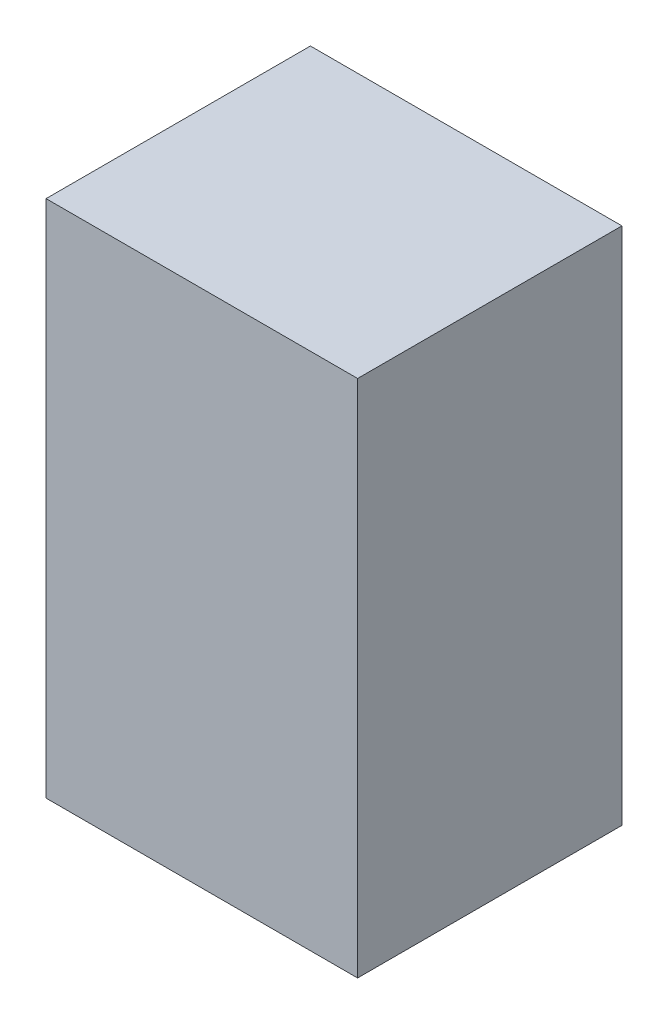
ISO-10303-21;
HEADER;
FILE_DESCRIPTION(('STEP AP214'),'2;1');
FILE_NAME('part.step','',(''),(''),'','','');
FILE_SCHEMA(('AUTOMOTIVE_DESIGN { 1 0 10303 214 1 1 1 1 }'));
ENDSEC;
DATA;
#1=APPLICATION_CONTEXT('core data for automotive mechanical design processes');
#2=APPLICATION_PROTOCOL_DEFINITION('international standard','automotive_design',2000,#1);
#3=PRODUCT_CONTEXT('',#1,'mechanical');
#4=PRODUCT('Part','Part','',(#3));
#5=PRODUCT_RELATED_PRODUCT_CATEGORY('part','',(#4));
#6=PRODUCT_DEFINITION_FORMATION('','',#4);
#7=PRODUCT_DEFINITION_CONTEXT('part definition',#1,'design');
#8=PRODUCT_DEFINITION('design','',#6,#7);
#9=PRODUCT_DEFINITION_SHAPE('','',#8);
#10=(LENGTH_UNIT() NAMED_UNIT(*) SI_UNIT(.MILLI.,.METRE.));
#11=(NAMED_UNIT(*) PLANE_ANGLE_UNIT() SI_UNIT($,.RADIAN.));
#12=(NAMED_UNIT(*) SI_UNIT($,.STERADIAN.) SOLID_ANGLE_UNIT());
#13=UNCERTAINTY_MEASURE_WITH_UNIT(LENGTH_MEASURE(1.E-05),#10,'distance_accuracy_value','');
#14=(GEOMETRIC_REPRESENTATION_CONTEXT(3) GLOBAL_UNCERTAINTY_ASSIGNED_CONTEXT((#13)) GLOBAL_UNIT_ASSIGNED_CONTEXT((#10,
#11,#12)) REPRESENTATION_CONTEXT('',''));
#15=CARTESIAN_POINT('',(0.,0.,0.));
#16=DIRECTION('',(0.,0.,1.));
#17=DIRECTION('',(1.,0.,0.));
#18=AXIS2_PLACEMENT_3D('',#15,#16,#17);
#19=CARTESIAN_POINT('',(0.,1397.,0.));
#20=DIRECTION('',(1.,0.,0.));
#21=DIRECTION('',(0.,0.,-1.));
#22=AXIS2_PLACEMENT_3D('',#19,#20,#21);
#23=PLANE('',#22);
#24=DIRECTION('',(0.,0.,1.));
#25=VECTOR('',#24,1.);
#26=CARTESIAN_POINT('',(0.,0.,0.));
#27=LINE('',#26,#25);
#28=CARTESIAN_POINT('',(0.,0.,-711.2));
#29=VERTEX_POINT('',#28);
#30=CARTESIAN_POINT('',(0.,0.,0.));
#31=VERTEX_POINT('',#30);
#32=EDGE_CURVE('E95',#29,#31,#27,.T.);
#33=ORIENTED_EDGE('',*,*,#32,.T.);
#34=DIRECTION('',(0.,-1.,0.));
#35=VECTOR('',#34,1.);
#36=CARTESIAN_POINT('',(0.,1397.,0.));
#37=LINE('',#36,#35);
#38=CARTESIAN_POINT('',(0.,1397.,0.));
#39=VERTEX_POINT('',#38);
#40=EDGE_CURVE('E11',#39,#31,#37,.T.);
#41=ORIENTED_EDGE('',*,*,#40,.F.);
#42=DIRECTION('',(0.,0.,1.));
#43=VECTOR('',#42,1.);
#44=CARTESIAN_POINT('',(0.,1397.,0.));
#45=LINE('',#44,#43);
#46=CARTESIAN_POINT('',(0.,1397.,-711.2));
#47=VERTEX_POINT('',#46);
#48=EDGE_CURVE('E83',#47,#39,#45,.T.);
#49=ORIENTED_EDGE('',*,*,#48,.F.);
#50=DIRECTION('',(0.,-1.,0.));
#51=VECTOR('',#50,1.);
#52=CARTESIAN_POINT('',(0.,1397.,-711.2));
#53=LINE('',#52,#51);
#54=EDGE_CURVE('E91',#47,#29,#53,.T.);
#55=ORIENTED_EDGE('',*,*,#54,.T.);
#56=EDGE_LOOP('',(#33,#41,#49,#55));
#57=FACE_BOUND('',#56,.T.);
#58=ADVANCED_FACE('F32',(#57),#23,.F.);
#59=CARTESIAN_POINT('',(0.,1397.,0.));
#60=DIRECTION('',(0.,0.,-1.));
#61=DIRECTION('',(-1.,0.,0.));
#62=AXIS2_PLACEMENT_3D('',#59,#60,#61);
#63=PLANE('',#62);
#64=DIRECTION('',(1.,0.,0.));
#65=VECTOR('',#64,1.);
#66=CARTESIAN_POINT('',(0.,0.,0.));
#67=LINE('',#66,#65);
#68=CARTESIAN_POINT('',(838.2,0.,0.));
#69=VERTEX_POINT('',#68);
#70=EDGE_CURVE('E87',#31,#69,#67,.T.);
#71=ORIENTED_EDGE('',*,*,#70,.T.);
#72=DIRECTION('',(0.,-1.,0.));
#73=VECTOR('',#72,1.);
#74=CARTESIAN_POINT('',(838.2,1397.,0.));
#75=LINE('',#74,#73);
#76=CARTESIAN_POINT('',(838.2,1397.,0.));
#77=VERTEX_POINT('',#76);
#78=EDGE_CURVE('E40',#77,#69,#75,.T.);
#79=ORIENTED_EDGE('',*,*,#78,.F.);
#80=DIRECTION('',(1.,0.,0.));
#81=VECTOR('',#80,1.);
#82=CARTESIAN_POINT('',(0.,1397.,0.));
#83=LINE('',#82,#81);
#84=EDGE_CURVE('E78',#39,#77,#83,.T.);
#85=ORIENTED_EDGE('',*,*,#84,.F.);
#86=ORIENTED_EDGE('',*,*,#40,.T.);
#87=EDGE_LOOP('',(#71,#79,#85,#86));
#88=FACE_BOUND('',#87,.T.);
#89=ADVANCED_FACE('F86',(#88),#63,.F.);
#90=CARTESIAN_POINT('',(838.2,1397.,0.));
#91=DIRECTION('',(-1.,0.,0.));
#92=DIRECTION('',(0.,0.,1.));
#93=AXIS2_PLACEMENT_3D('',#90,#91,#92);
#94=PLANE('',#93);
#95=DIRECTION('',(0.,0.,-1.));
#96=VECTOR('',#95,1.);
#97=CARTESIAN_POINT('',(838.2,0.,0.));
#98=LINE('',#97,#96);
#99=CARTESIAN_POINT('',(838.2,0.,-711.2));
#100=VERTEX_POINT('',#99);
#101=EDGE_CURVE('E65',#69,#100,#98,.T.);
#102=ORIENTED_EDGE('',*,*,#101,.T.);
#103=DIRECTION('',(0.,-1.,0.));
#104=VECTOR('',#103,1.);
#105=CARTESIAN_POINT('',(838.2,1397.,-711.2));
#106=LINE('',#105,#104);
#107=CARTESIAN_POINT('',(838.2,1397.,-711.2));
#108=VERTEX_POINT('',#107);
#109=EDGE_CURVE('E88',#108,#100,#106,.T.);
#110=ORIENTED_EDGE('',*,*,#109,.F.);
#111=DIRECTION('',(0.,0.,-1.));
#112=VECTOR('',#111,1.);
#113=CARTESIAN_POINT('',(838.2,1397.,0.));
#114=LINE('',#113,#112);
#115=EDGE_CURVE('E81',#77,#108,#114,.T.);
#116=ORIENTED_EDGE('',*,*,#115,.F.);
#117=ORIENTED_EDGE('',*,*,#78,.T.);
#118=EDGE_LOOP('',(#102,#110,#116,#117));
#119=FACE_BOUND('',#118,.T.);
#120=ADVANCED_FACE('F89',(#119),#94,.F.);
#121=CARTESIAN_POINT('',(0.,1397.,-711.2));
#122=DIRECTION('',(0.,0.,1.));
#123=DIRECTION('',(1.,0.,0.));
#124=AXIS2_PLACEMENT_3D('',#121,#122,#123);
#125=PLANE('',#124);
#126=DIRECTION('',(-1.,0.,0.));
#127=VECTOR('',#126,1.);
#128=CARTESIAN_POINT('',(0.,0.,-711.2));
#129=LINE('',#128,#127);
#130=EDGE_CURVE('E71',#100,#29,#129,.T.);
#131=ORIENTED_EDGE('',*,*,#130,.T.);
#132=ORIENTED_EDGE('',*,*,#54,.F.);
#133=DIRECTION('',(-1.,0.,0.));
#134=VECTOR('',#133,1.);
#135=CARTESIAN_POINT('',(0.,1397.,-711.2));
#136=LINE('',#135,#134);
#137=EDGE_CURVE('E48',#108,#47,#136,.T.);
#138=ORIENTED_EDGE('',*,*,#137,.F.);
#139=ORIENTED_EDGE('',*,*,#109,.T.);
#140=EDGE_LOOP('',(#131,#132,#138,#139));
#141=FACE_BOUND('',#140,.T.);
#142=ADVANCED_FACE('F102',(#141),#125,.F.);
#143=CARTESIAN_POINT('',(0.,1397.,0.));
#144=DIRECTION('',(0.,-1.,0.));
#145=DIRECTION('',(0.,0.,-1.));
#146=AXIS2_PLACEMENT_3D('',#143,#144,#145);
#147=PLANE('',#146);
#148=ORIENTED_EDGE('',*,*,#48,.T.);
#149=ORIENTED_EDGE('',*,*,#84,.T.);
#150=ORIENTED_EDGE('',*,*,#115,.T.);
#151=ORIENTED_EDGE('',*,*,#137,.T.);
#152=EDGE_LOOP('',(#148,#149,#150,#151));
#153=FACE_BOUND('',#152,.T.);
#154=ADVANCED_FACE('F79',(#153),#147,.F.);
#155=CARTESIAN_POINT('',(0.,0.,0.));
#156=DIRECTION('',(0.,-1.,0.));
#157=DIRECTION('',(0.,0.,-1.));
#158=AXIS2_PLACEMENT_3D('',#155,#156,#157);
#159=PLANE('',#158);
#160=ORIENTED_EDGE('',*,*,#32,.F.);
#161=ORIENTED_EDGE('',*,*,#130,.F.);
#162=ORIENTED_EDGE('',*,*,#101,.F.);
#163=ORIENTED_EDGE('',*,*,#70,.F.);
#164=EDGE_LOOP('',(#160,#161,#162,#163));
#165=FACE_BOUND('',#164,.T.);
#166=ADVANCED_FACE('F105',(#165),#159,.T.);
#167=CLOSED_SHELL('',(#58,#89,#120,#142,#154,#166));
#168=MANIFOLD_SOLID_BREP('B2',#167);
#169=ADVANCED_BREP_SHAPE_REPRESENTATION('',(#18,#168),#14);
#170=SHAPE_DEFINITION_REPRESENTATION(#9,#169);
ENDSEC;
END-ISO-10303-21;
